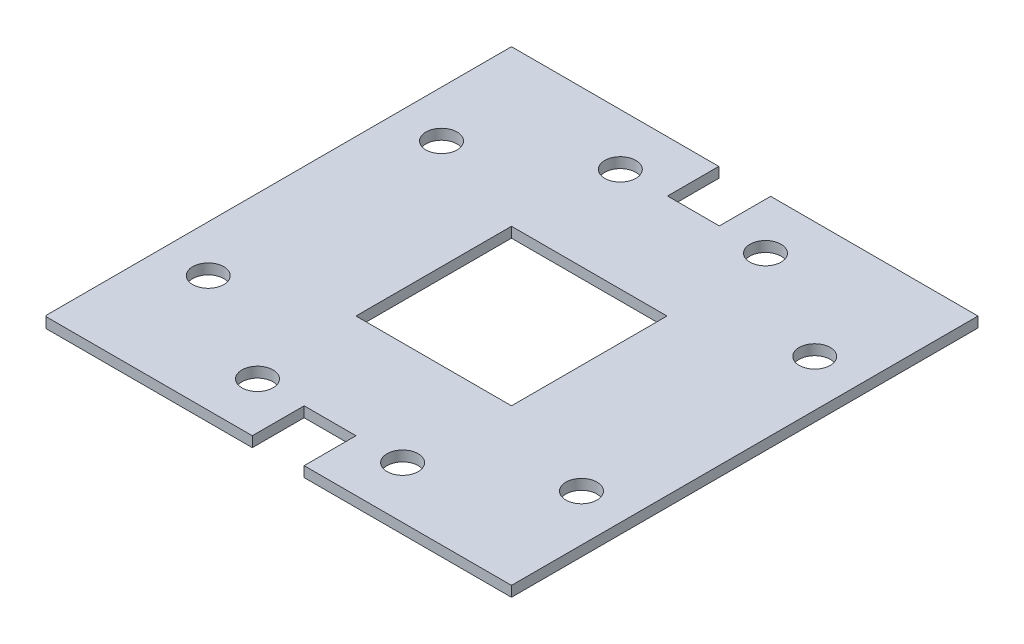
ISO-10303-21;
HEADER;
FILE_DESCRIPTION(('STEP AP214'),'2;1');
FILE_NAME('part.step','',(''),(''),'','','');
FILE_SCHEMA(('AUTOMOTIVE_DESIGN { 1 0 10303 214 1 1 1 1 }'));
ENDSEC;
DATA;
#1=APPLICATION_CONTEXT('core data for automotive mechanical design processes');
#2=APPLICATION_PROTOCOL_DEFINITION('international standard','automotive_design',2000,#1);
#3=PRODUCT_CONTEXT('',#1,'mechanical');
#4=PRODUCT('Part','Part','',(#3));
#5=PRODUCT_RELATED_PRODUCT_CATEGORY('part','',(#4));
#6=PRODUCT_DEFINITION_FORMATION('','',#4);
#7=PRODUCT_DEFINITION_CONTEXT('part definition',#1,'design');
#8=PRODUCT_DEFINITION('design','',#6,#7);
#9=PRODUCT_DEFINITION_SHAPE('','',#8);
#10=(LENGTH_UNIT() NAMED_UNIT(*) SI_UNIT(.MILLI.,.METRE.));
#11=(NAMED_UNIT(*) PLANE_ANGLE_UNIT() SI_UNIT($,.RADIAN.));
#12=(NAMED_UNIT(*) SI_UNIT($,.STERADIAN.) SOLID_ANGLE_UNIT());
#13=UNCERTAINTY_MEASURE_WITH_UNIT(LENGTH_MEASURE(1.E-05),#10,'distance_accuracy_value','');
#14=(GEOMETRIC_REPRESENTATION_CONTEXT(3) GLOBAL_UNCERTAINTY_ASSIGNED_CONTEXT((#13)) GLOBAL_UNIT_ASSIGNED_CONTEXT((#10,
#11,#12)) REPRESENTATION_CONTEXT('',''));
#15=CARTESIAN_POINT('',(0.,0.,0.));
#16=DIRECTION('',(0.,0.,1.));
#17=DIRECTION('',(1.,0.,0.));
#18=AXIS2_PLACEMENT_3D('',#15,#16,#17);
#19=CARTESIAN_POINT('',(0.,1.,15.));
#20=DIRECTION('',(0.,0.,-1.));
#21=DIRECTION('',(-1.,0.,0.));
#22=AXIS2_PLACEMENT_3D('',#19,#20,#21);
#23=PLANE('',#22);
#24=DIRECTION('',(1.,0.,0.));
#25=VECTOR('',#24,1.);
#26=CARTESIAN_POINT('',(0.,0.,15.));
#27=LINE('',#26,#25);
#28=CARTESIAN_POINT('',(-14.8984531823095,0.,15.));
#29=VERTEX_POINT('',#28);
#30=CARTESIAN_POINT('',(5.,0.,15.));
#31=VERTEX_POINT('',#30);
#32=EDGE_CURVE('E290',#29,#31,#27,.T.);
#33=ORIENTED_EDGE('',*,*,#32,.T.);
#34=DIRECTION('',(0.,1.,0.));
#35=VECTOR('',#34,1.);
#36=CARTESIAN_POINT('',(5.,-9.,15.));
#37=LINE('',#36,#35);
#38=CARTESIAN_POINT('',(5.,1.,15.));
#39=VERTEX_POINT('',#38);
#40=EDGE_CURVE('E191',#31,#39,#37,.T.);
#41=ORIENTED_EDGE('',*,*,#40,.T.);
#42=DIRECTION('',(1.,0.,0.));
#43=VECTOR('',#42,1.);
#44=CARTESIAN_POINT('',(0.,1.,15.));
#45=LINE('',#44,#43);
#46=CARTESIAN_POINT('',(-14.8984531823095,1.,15.));
#47=VERTEX_POINT('',#46);
#48=EDGE_CURVE('E238',#47,#39,#45,.T.);
#49=ORIENTED_EDGE('',*,*,#48,.F.);
#50=DIRECTION('',(0.,-1.,0.));
#51=VECTOR('',#50,1.);
#52=CARTESIAN_POINT('',(-14.8984531823095,1.,15.));
#53=LINE('',#52,#51);
#54=EDGE_CURVE('E311',#47,#29,#53,.T.);
#55=ORIENTED_EDGE('',*,*,#54,.T.);
#56=EDGE_LOOP('',(#33,#41,#49,#55));
#57=FACE_BOUND('',#56,.T.);
#58=ADVANCED_FACE('F34',(#57),#23,.F.);
#59=CARTESIAN_POINT('',(0.,1.,-30.));
#60=DIRECTION('',(0.,0.,-1.));
#61=DIRECTION('',(-1.,0.,0.));
#62=AXIS2_PLACEMENT_3D('',#59,#60,#61);
#63=PLANE('',#62);
#64=DIRECTION('',(0.,1.,0.));
#65=VECTOR('',#64,1.);
#66=CARTESIAN_POINT('',(5.,-9.,-30.));
#67=LINE('',#66,#65);
#68=CARTESIAN_POINT('',(5.,0.,-30.));
#69=VERTEX_POINT('',#68);
#70=CARTESIAN_POINT('',(5.,1.,-30.));
#71=VERTEX_POINT('',#70);
#72=EDGE_CURVE('E166',#69,#71,#67,.T.);
#73=ORIENTED_EDGE('',*,*,#72,.F.);
#74=DIRECTION('',(1.,0.,0.));
#75=VECTOR('',#74,1.);
#76=CARTESIAN_POINT('',(0.,0.,-30.));
#77=LINE('',#76,#75);
#78=CARTESIAN_POINT('',(-15.,0.,-30.));
#79=VERTEX_POINT('',#78);
#80=EDGE_CURVE('E297',#79,#69,#77,.T.);
#81=ORIENTED_EDGE('',*,*,#80,.F.);
#82=DIRECTION('',(0.,-1.,0.));
#83=VECTOR('',#82,1.);
#84=CARTESIAN_POINT('',(-15.,1.,-30.));
#85=LINE('',#84,#83);
#86=CARTESIAN_POINT('',(-15.,1.,-30.));
#87=VERTEX_POINT('',#86);
#88=EDGE_CURVE('E302',#87,#79,#85,.T.);
#89=ORIENTED_EDGE('',*,*,#88,.F.);
#90=DIRECTION('',(1.,0.,0.));
#91=VECTOR('',#90,1.);
#92=CARTESIAN_POINT('',(0.,1.,-30.));
#93=LINE('',#92,#91);
#94=EDGE_CURVE('E245',#87,#71,#93,.T.);
#95=ORIENTED_EDGE('',*,*,#94,.T.);
#96=EDGE_LOOP('',(#73,#81,#89,#95));
#97=FACE_BOUND('',#96,.T.);
#98=ADVANCED_FACE('F371',(#97),#63,.T.);
#99=CARTESIAN_POINT('',(-15.,1.,0.));
#100=DIRECTION('',(-1.,0.,0.));
#101=DIRECTION('',(0.,0.,1.));
#102=AXIS2_PLACEMENT_3D('',#99,#100,#101);
#103=PLANE('',#102);
#104=DIRECTION('',(0.,0.,-1.));
#105=VECTOR('',#104,1.);
#106=CARTESIAN_POINT('',(-15.,0.,0.));
#107=LINE('',#106,#105);
#108=CARTESIAN_POINT('',(-15.,0.,14.8984531823095));
#109=VERTEX_POINT('',#108);
#110=EDGE_CURVE('E283',#109,#79,#107,.T.);
#111=ORIENTED_EDGE('',*,*,#110,.F.);
#112=DIRECTION('',(0.,-1.,0.));
#113=VECTOR('',#112,1.);
#114=CARTESIAN_POINT('',(-15.,1.,14.8984531823095));
#115=LINE('',#114,#113);
#116=CARTESIAN_POINT('',(-15.,1.,14.8984531823095));
#117=VERTEX_POINT('',#116);
#118=EDGE_CURVE('E314',#117,#109,#115,.T.);
#119=ORIENTED_EDGE('',*,*,#118,.F.);
#120=DIRECTION('',(0.,0.,-1.));
#121=VECTOR('',#120,1.);
#122=CARTESIAN_POINT('',(-15.,1.,0.));
#123=LINE('',#122,#121);
#124=EDGE_CURVE('E231',#117,#87,#123,.T.);
#125=ORIENTED_EDGE('',*,*,#124,.T.);
#126=ORIENTED_EDGE('',*,*,#88,.T.);
#127=EDGE_LOOP('',(#111,#119,#125,#126));
#128=FACE_BOUND('',#127,.T.);
#129=ADVANCED_FACE('F368',(#128),#103,.T.);
#130=CARTESIAN_POINT('',(-12.4748737341527,1.,12.4748737341527));
#131=DIRECTION('',(0.,-1.,0.));
#132=DIRECTION('',(0.,0.,-1.));
#133=AXIS2_PLACEMENT_3D('',#130,#131,#132);
#134=CYLINDRICAL_SURFACE('',#133,3.5);
#135=CARTESIAN_POINT('',(-12.4748737341527,0.,12.4748737341527));
#136=DIRECTION('',(0.,1.,0.));
#137=DIRECTION('',(0.,0.,1.));
#138=AXIS2_PLACEMENT_3D('',#135,#136,#137);
#139=CIRCLE('',#138,3.5);
#140=EDGE_CURVE('E286',#109,#29,#139,.T.);
#141=ORIENTED_EDGE('',*,*,#140,.T.);
#142=ORIENTED_EDGE('',*,*,#54,.F.);
#143=CARTESIAN_POINT('',(-12.4748737341527,1.,12.4748737341527));
#144=DIRECTION('',(0.,1.,0.));
#145=DIRECTION('',(0.,0.,1.));
#146=AXIS2_PLACEMENT_3D('',#143,#144,#145);
#147=CIRCLE('',#146,3.5);
#148=EDGE_CURVE('E234',#117,#47,#147,.T.);
#149=ORIENTED_EDGE('',*,*,#148,.F.);
#150=ORIENTED_EDGE('',*,*,#118,.T.);
#151=EDGE_LOOP('',(#141,#142,#149,#150));
#152=FACE_BOUND('',#151,.T.);
#153=ADVANCED_FACE('F364',(#152),#134,.T.);
#154=CARTESIAN_POINT('',(9.99999999999999,1.,15.));
#155=VERTEX_POINT('',#154);
#156=CARTESIAN_POINT('',(30.,1.,15.));
#157=VERTEX_POINT('',#156);
#158=EDGE_CURVE('E237',#155,#157,#45,.T.);
#159=ORIENTED_EDGE('',*,*,#158,.F.);
#160=DIRECTION('',(0.,1.,0.));
#161=VECTOR('',#160,1.);
#162=CARTESIAN_POINT('',(9.99999999999999,-9.,15.));
#163=LINE('',#162,#161);
#164=CARTESIAN_POINT('',(9.99999999999999,0.,15.));
#165=VERTEX_POINT('',#164);
#166=EDGE_CURVE('E194',#165,#155,#163,.T.);
#167=ORIENTED_EDGE('',*,*,#166,.F.);
#168=CARTESIAN_POINT('',(30.,0.,15.));
#169=VERTEX_POINT('',#168);
#170=EDGE_CURVE('E289',#165,#169,#27,.T.);
#171=ORIENTED_EDGE('',*,*,#170,.T.);
#172=DIRECTION('',(0.,-1.,0.));
#173=VECTOR('',#172,1.);
#174=CARTESIAN_POINT('',(30.,1.,15.));
#175=LINE('',#174,#173);
#176=EDGE_CURVE('E308',#157,#169,#175,.T.);
#177=ORIENTED_EDGE('',*,*,#176,.F.);
#178=EDGE_LOOP('',(#159,#167,#171,#177));
#179=FACE_BOUND('',#178,.T.);
#180=ADVANCED_FACE('F350',(#179),#23,.F.);
#181=CARTESIAN_POINT('',(30.,1.,0.));
#182=DIRECTION('',(-1.,0.,0.));
#183=DIRECTION('',(0.,0.,1.));
#184=AXIS2_PLACEMENT_3D('',#181,#182,#183);
#185=PLANE('',#184);
#186=DIRECTION('',(0.,0.,-1.));
#187=VECTOR('',#186,1.);
#188=CARTESIAN_POINT('',(30.,0.,0.));
#189=LINE('',#188,#187);
#190=CARTESIAN_POINT('',(30.,0.,-30.));
#191=VERTEX_POINT('',#190);
#192=EDGE_CURVE('E293',#169,#191,#189,.T.);
#193=ORIENTED_EDGE('',*,*,#192,.T.);
#194=DIRECTION('',(0.,-1.,0.));
#195=VECTOR('',#194,1.);
#196=CARTESIAN_POINT('',(30.,1.,-30.));
#197=LINE('',#196,#195);
#198=CARTESIAN_POINT('',(30.,1.,-30.));
#199=VERTEX_POINT('',#198);
#200=EDGE_CURVE('E304',#199,#191,#197,.T.);
#201=ORIENTED_EDGE('',*,*,#200,.F.);
#202=DIRECTION('',(0.,0.,-1.));
#203=VECTOR('',#202,1.);
#204=CARTESIAN_POINT('',(30.,1.,0.));
#205=LINE('',#204,#203);
#206=EDGE_CURVE('E241',#157,#199,#205,.T.);
#207=ORIENTED_EDGE('',*,*,#206,.F.);
#208=ORIENTED_EDGE('',*,*,#176,.T.);
#209=EDGE_LOOP('',(#193,#201,#207,#208));
#210=FACE_BOUND('',#209,.T.);
#211=ADVANCED_FACE('F344',(#210),#185,.F.);
#212=CARTESIAN_POINT('',(15.,1.,0.));
#213=DIRECTION('',(-1.,0.,0.));
#214=DIRECTION('',(0.,0.,1.));
#215=AXIS2_PLACEMENT_3D('',#212,#213,#214);
#216=PLANE('',#215);
#217=DIRECTION('',(0.,0.,-1.));
#218=VECTOR('',#217,1.);
#219=CARTESIAN_POINT('',(15.,0.,0.));
#220=LINE('',#219,#218);
#221=CARTESIAN_POINT('',(15.,0.,0.));
#222=VERTEX_POINT('',#221);
#223=CARTESIAN_POINT('',(15.,0.,-15.));
#224=VERTEX_POINT('',#223);
#225=EDGE_CURVE('E268',#222,#224,#220,.T.);
#226=ORIENTED_EDGE('',*,*,#225,.F.);
#227=DIRECTION('',(0.,-1.,0.));
#228=VECTOR('',#227,1.);
#229=CARTESIAN_POINT('',(15.,1.,0.));
#230=LINE('',#229,#228);
#231=CARTESIAN_POINT('',(15.,1.,0.));
#232=VERTEX_POINT('',#231);
#233=EDGE_CURVE('E305',#232,#222,#230,.T.);
#234=ORIENTED_EDGE('',*,*,#233,.F.);
#235=DIRECTION('',(0.,0.,-1.));
#236=VECTOR('',#235,1.);
#237=CARTESIAN_POINT('',(15.,1.,0.));
#238=LINE('',#237,#236);
#239=CARTESIAN_POINT('',(15.,1.,-15.));
#240=VERTEX_POINT('',#239);
#241=EDGE_CURVE('E217',#232,#240,#238,.T.);
#242=ORIENTED_EDGE('',*,*,#241,.T.);
#243=DIRECTION('',(0.,-1.,0.));
#244=VECTOR('',#243,1.);
#245=CARTESIAN_POINT('',(15.,1.,-15.));
#246=LINE('',#245,#244);
#247=EDGE_CURVE('E250',#240,#224,#246,.T.);
#248=ORIENTED_EDGE('',*,*,#247,.T.);
#249=EDGE_LOOP('',(#226,#234,#242,#248));
#250=FACE_BOUND('',#249,.T.);
#251=ADVANCED_FACE('F398',(#250),#216,.T.);
#252=CARTESIAN_POINT('',(0.,1.,0.));
#253=DIRECTION('',(0.,0.,-1.));
#254=DIRECTION('',(-1.,0.,0.));
#255=AXIS2_PLACEMENT_3D('',#252,#253,#254);
#256=PLANE('',#255);
#257=DIRECTION('',(1.,0.,0.));
#258=VECTOR('',#257,1.);
#259=CARTESIAN_POINT('',(0.,0.,0.));
#260=LINE('',#259,#258);
#261=CARTESIAN_POINT('',(0.,0.,0.));
#262=VERTEX_POINT('',#261);
#263=EDGE_CURVE('E271',#262,#222,#260,.T.);
#264=ORIENTED_EDGE('',*,*,#263,.F.);
#265=DIRECTION('',(0.,-1.,0.));
#266=VECTOR('',#265,1.);
#267=CARTESIAN_POINT('',(0.,1.,0.));
#268=LINE('',#267,#266);
#269=CARTESIAN_POINT('',(0.,1.,0.));
#270=VERTEX_POINT('',#269);
#271=EDGE_CURVE('E321',#270,#262,#268,.T.);
#272=ORIENTED_EDGE('',*,*,#271,.F.);
#273=DIRECTION('',(1.,0.,0.));
#274=VECTOR('',#273,1.);
#275=CARTESIAN_POINT('',(0.,1.,0.));
#276=LINE('',#275,#274);
#277=EDGE_CURVE('E220',#270,#232,#276,.T.);
#278=ORIENTED_EDGE('',*,*,#277,.T.);
#279=ORIENTED_EDGE('',*,*,#233,.T.);
#280=EDGE_LOOP('',(#264,#272,#278,#279));
#281=FACE_BOUND('',#280,.T.);
#282=ADVANCED_FACE('F392',(#281),#256,.T.);
#283=CARTESIAN_POINT('',(0.,1.,0.));
#284=DIRECTION('',(-1.,0.,0.));
#285=DIRECTION('',(0.,0.,1.));
#286=AXIS2_PLACEMENT_3D('',#283,#284,#285);
#287=PLANE('',#286);
#288=DIRECTION('',(0.,0.,-1.));
#289=VECTOR('',#288,1.);
#290=CARTESIAN_POINT('',(0.,0.,0.));
#291=LINE('',#290,#289);
#292=CARTESIAN_POINT('',(0.,0.,-15.));
#293=VERTEX_POINT('',#292);
#294=EDGE_CURVE('E274',#262,#293,#291,.T.);
#295=ORIENTED_EDGE('',*,*,#294,.T.);
#296=DIRECTION('',(0.,-1.,0.));
#297=VECTOR('',#296,1.);
#298=CARTESIAN_POINT('',(0.,1.,-15.));
#299=LINE('',#298,#297);
#300=CARTESIAN_POINT('',(0.,1.,-15.));
#301=VERTEX_POINT('',#300);
#302=EDGE_CURVE('E318',#301,#293,#299,.T.);
#303=ORIENTED_EDGE('',*,*,#302,.F.);
#304=DIRECTION('',(0.,0.,-1.));
#305=VECTOR('',#304,1.);
#306=CARTESIAN_POINT('',(0.,1.,0.));
#307=LINE('',#306,#305);
#308=EDGE_CURVE('E223',#270,#301,#307,.T.);
#309=ORIENTED_EDGE('',*,*,#308,.F.);
#310=ORIENTED_EDGE('',*,*,#271,.T.);
#311=EDGE_LOOP('',(#295,#303,#309,#310));
#312=FACE_BOUND('',#311,.T.);
#313=ADVANCED_FACE('F384',(#312),#287,.F.);
#314=DIRECTION('',(0.,1.,0.));
#315=VECTOR('',#314,1.);
#316=CARTESIAN_POINT('',(9.99999999999999,-9.,-30.));
#317=LINE('',#316,#315);
#318=CARTESIAN_POINT('',(9.99999999999999,0.,-30.));
#319=VERTEX_POINT('',#318);
#320=CARTESIAN_POINT('',(9.99999999999999,1.,-30.));
#321=VERTEX_POINT('',#320);
#322=EDGE_CURVE('E180',#319,#321,#317,.T.);
#323=ORIENTED_EDGE('',*,*,#322,.T.);
#324=EDGE_CURVE('E244',#321,#199,#93,.T.);
#325=ORIENTED_EDGE('',*,*,#324,.T.);
#326=ORIENTED_EDGE('',*,*,#200,.T.);
#327=EDGE_CURVE('E296',#319,#191,#77,.T.);
#328=ORIENTED_EDGE('',*,*,#327,.F.);
#329=EDGE_LOOP('',(#323,#325,#326,#328));
#330=FACE_BOUND('',#329,.T.);
#331=ADVANCED_FACE('F340',(#330),#63,.T.);
#332=CARTESIAN_POINT('',(-10.5,1.,3.75));
#333=DIRECTION('',(0.,-1.,0.));
#334=DIRECTION('',(0.,0.,-1.));
#335=AXIS2_PLACEMENT_3D('',#332,#333,#334);
#336=CYLINDRICAL_SURFACE('',#335,1.5);
#337=CARTESIAN_POINT('',(-10.5,1.,3.75));
#338=DIRECTION('',(0.,1.,0.));
#339=DIRECTION('',(0.,0.,1.));
#340=AXIS2_PLACEMENT_3D('',#337,#338,#339);
#341=CIRCLE('',#340,1.5);
#342=CARTESIAN_POINT('',(-10.5,1.,5.25));
#343=VERTEX_POINT('',#342);
#344=EDGE_CURVE('E228',#343,#343,#341,.F.);
#345=ORIENTED_EDGE('',*,*,#344,.F.);
#346=EDGE_LOOP('',(#345));
#347=FACE_BOUND('',#346,.T.);
#348=CARTESIAN_POINT('',(-10.5,0.,3.75));
#349=DIRECTION('',(0.,1.,0.));
#350=DIRECTION('',(0.,0.,1.));
#351=AXIS2_PLACEMENT_3D('',#348,#349,#350);
#352=CIRCLE('',#351,1.5);
#353=CARTESIAN_POINT('',(-10.5,0.,5.25));
#354=VERTEX_POINT('',#353);
#355=EDGE_CURVE('E280',#354,#354,#352,.F.);
#356=ORIENTED_EDGE('',*,*,#355,.T.);
#357=EDGE_LOOP('',(#356));
#358=FACE_BOUND('',#357,.T.);
#359=ADVANCED_FACE('F383',(#347,#358),#336,.F.);
#360=CARTESIAN_POINT('',(0.,1.,-15.));
#361=DIRECTION('',(0.,0.,-1.));
#362=DIRECTION('',(-1.,0.,0.));
#363=AXIS2_PLACEMENT_3D('',#360,#361,#362);
#364=PLANE('',#363);
#365=DIRECTION('',(1.,0.,0.));
#366=VECTOR('',#365,1.);
#367=CARTESIAN_POINT('',(0.,0.,-15.));
#368=LINE('',#367,#366);
#369=EDGE_CURVE('E277',#293,#224,#368,.T.);
#370=ORIENTED_EDGE('',*,*,#369,.T.);
#371=ORIENTED_EDGE('',*,*,#247,.F.);
#372=DIRECTION('',(1.,0.,0.));
#373=VECTOR('',#372,1.);
#374=CARTESIAN_POINT('',(0.,1.,-15.));
#375=LINE('',#374,#373);
#376=EDGE_CURVE('E226',#301,#240,#375,.T.);
#377=ORIENTED_EDGE('',*,*,#376,.F.);
#378=ORIENTED_EDGE('',*,*,#302,.T.);
#379=EDGE_LOOP('',(#370,#371,#377,#378));
#380=FACE_BOUND('',#379,.T.);
#381=ADVANCED_FACE('F389',(#380),#364,.F.);
#382=CARTESIAN_POINT('',(-10.5,1.,-18.75));
#383=DIRECTION('',(0.,-1.,0.));
#384=DIRECTION('',(0.,0.,-1.));
#385=AXIS2_PLACEMENT_3D('',#382,#383,#384);
#386=CYLINDRICAL_SURFACE('',#385,1.5);
#387=CARTESIAN_POINT('',(-10.5,1.,-18.75));
#388=DIRECTION('',(0.,1.,0.));
#389=DIRECTION('',(0.,0.,1.));
#390=AXIS2_PLACEMENT_3D('',#387,#388,#389);
#391=CIRCLE('',#390,1.5);
#392=CARTESIAN_POINT('',(-10.5,1.,-17.25));
#393=VERTEX_POINT('',#392);
#394=EDGE_CURVE('E214',#393,#393,#391,.F.);
#395=ORIENTED_EDGE('',*,*,#394,.F.);
#396=EDGE_LOOP('',(#395));
#397=FACE_BOUND('',#396,.T.);
#398=CARTESIAN_POINT('',(-10.5,0.,-18.75));
#399=DIRECTION('',(0.,1.,0.));
#400=DIRECTION('',(0.,0.,1.));
#401=AXIS2_PLACEMENT_3D('',#398,#399,#400);
#402=CIRCLE('',#401,1.5);
#403=CARTESIAN_POINT('',(-10.5,0.,-17.25));
#404=VERTEX_POINT('',#403);
#405=EDGE_CURVE('E265',#404,#404,#402,.F.);
#406=ORIENTED_EDGE('',*,*,#405,.T.);
#407=EDGE_LOOP('',(#406));
#408=FACE_BOUND('',#407,.T.);
#409=ADVANCED_FACE('F406',(#397,#408),#386,.F.);
#410=CARTESIAN_POINT('',(0.499999999999996,1.,-25.));
#411=DIRECTION('',(0.,-1.,0.));
#412=DIRECTION('',(0.,0.,-1.));
#413=AXIS2_PLACEMENT_3D('',#410,#411,#412);
#414=CYLINDRICAL_SURFACE('',#413,1.5);
#415=CARTESIAN_POINT('',(0.499999999999996,1.,-25.));
#416=DIRECTION('',(0.,1.,0.));
#417=DIRECTION('',(0.,0.,1.));
#418=AXIS2_PLACEMENT_3D('',#415,#416,#417);
#419=CIRCLE('',#418,1.5);
#420=CARTESIAN_POINT('',(0.499999999999996,1.,-23.5));
#421=VERTEX_POINT('',#420);
#422=EDGE_CURVE('E211',#421,#421,#419,.T.);
#423=ORIENTED_EDGE('',*,*,#422,.T.);
#424=EDGE_LOOP('',(#423));
#425=FACE_BOUND('',#424,.T.);
#426=CARTESIAN_POINT('',(0.499999999999996,0.,-25.));
#427=DIRECTION('',(0.,1.,0.));
#428=DIRECTION('',(0.,0.,1.));
#429=AXIS2_PLACEMENT_3D('',#426,#427,#428);
#430=CIRCLE('',#429,1.5);
#431=CARTESIAN_POINT('',(0.499999999999996,0.,-23.5));
#432=VERTEX_POINT('',#431);
#433=EDGE_CURVE('E262',#432,#432,#430,.T.);
#434=ORIENTED_EDGE('',*,*,#433,.F.);
#435=EDGE_LOOP('',(#434));
#436=FACE_BOUND('',#435,.T.);
#437=ADVANCED_FACE('F409',(#425,#436),#414,.F.);
#438=CARTESIAN_POINT('',(14.5,1.,-25.));
#439=DIRECTION('',(0.,-1.,0.));
#440=DIRECTION('',(0.,0.,-1.));
#441=AXIS2_PLACEMENT_3D('',#438,#439,#440);
#442=CYLINDRICAL_SURFACE('',#441,1.5);
#443=CARTESIAN_POINT('',(14.5,1.,-25.));
#444=DIRECTION('',(0.,1.,0.));
#445=DIRECTION('',(0.,0.,1.));
#446=AXIS2_PLACEMENT_3D('',#443,#444,#445);
#447=CIRCLE('',#446,1.5);
#448=CARTESIAN_POINT('',(14.5,1.,-23.5));
#449=VERTEX_POINT('',#448);
#450=EDGE_CURVE('E208',#449,#449,#447,.T.);
#451=ORIENTED_EDGE('',*,*,#450,.T.);
#452=EDGE_LOOP('',(#451));
#453=FACE_BOUND('',#452,.T.);
#454=CARTESIAN_POINT('',(14.5,0.,-25.));
#455=DIRECTION('',(0.,1.,0.));
#456=DIRECTION('',(0.,0.,1.));
#457=AXIS2_PLACEMENT_3D('',#454,#455,#456);
#458=CIRCLE('',#457,1.5);
#459=CARTESIAN_POINT('',(14.5,0.,-23.5));
#460=VERTEX_POINT('',#459);
#461=EDGE_CURVE('E259',#460,#460,#458,.T.);
#462=ORIENTED_EDGE('',*,*,#461,.F.);
#463=EDGE_LOOP('',(#462));
#464=FACE_BOUND('',#463,.T.);
#465=ADVANCED_FACE('F413',(#453,#464),#442,.F.);
#466=CARTESIAN_POINT('',(14.5,1.,10.));
#467=DIRECTION('',(0.,-1.,0.));
#468=DIRECTION('',(0.,0.,-1.));
#469=AXIS2_PLACEMENT_3D('',#466,#467,#468);
#470=CYLINDRICAL_SURFACE('',#469,1.5);
#471=CARTESIAN_POINT('',(14.5,1.,10.));
#472=DIRECTION('',(0.,1.,0.));
#473=DIRECTION('',(0.,0.,1.));
#474=AXIS2_PLACEMENT_3D('',#471,#472,#473);
#475=CIRCLE('',#474,1.5);
#476=CARTESIAN_POINT('',(14.5,1.,11.5));
#477=VERTEX_POINT('',#476);
#478=EDGE_CURVE('E205',#477,#477,#475,.F.);
#479=ORIENTED_EDGE('',*,*,#478,.F.);
#480=EDGE_LOOP('',(#479));
#481=FACE_BOUND('',#480,.T.);
#482=CARTESIAN_POINT('',(14.5,0.,10.));
#483=DIRECTION('',(0.,1.,0.));
#484=DIRECTION('',(0.,0.,1.));
#485=AXIS2_PLACEMENT_3D('',#482,#483,#484);
#486=CIRCLE('',#485,1.5);
#487=CARTESIAN_POINT('',(14.5,0.,11.5));
#488=VERTEX_POINT('',#487);
#489=EDGE_CURVE('E256',#488,#488,#486,.F.);
#490=ORIENTED_EDGE('',*,*,#489,.T.);
#491=EDGE_LOOP('',(#490));
#492=FACE_BOUND('',#491,.T.);
#493=ADVANCED_FACE('F417',(#481,#492),#470,.F.);
#494=CARTESIAN_POINT('',(25.5,1.,-18.75));
#495=DIRECTION('',(0.,-1.,0.));
#496=DIRECTION('',(0.,0.,-1.));
#497=AXIS2_PLACEMENT_3D('',#494,#495,#496);
#498=CYLINDRICAL_SURFACE('',#497,1.5);
#499=CARTESIAN_POINT('',(25.5,1.,-18.75));
#500=DIRECTION('',(0.,1.,0.));
#501=DIRECTION('',(0.,0.,1.));
#502=AXIS2_PLACEMENT_3D('',#499,#500,#501);
#503=CIRCLE('',#502,1.5);
#504=CARTESIAN_POINT('',(25.5,1.,-17.25));
#505=VERTEX_POINT('',#504);
#506=EDGE_CURVE('E201',#505,#505,#503,.T.);
#507=ORIENTED_EDGE('',*,*,#506,.T.);
#508=EDGE_LOOP('',(#507));
#509=FACE_BOUND('',#508,.T.);
#510=CARTESIAN_POINT('',(25.5,0.,-18.75));
#511=DIRECTION('',(0.,1.,0.));
#512=DIRECTION('',(0.,0.,1.));
#513=AXIS2_PLACEMENT_3D('',#510,#511,#512);
#514=CIRCLE('',#513,1.5);
#515=CARTESIAN_POINT('',(25.5,0.,-17.25));
#516=VERTEX_POINT('',#515);
#517=EDGE_CURVE('E253',#516,#516,#514,.T.);
#518=ORIENTED_EDGE('',*,*,#517,.F.);
#519=EDGE_LOOP('',(#518));
#520=FACE_BOUND('',#519,.T.);
#521=ADVANCED_FACE('F420',(#509,#520),#498,.F.);
#522=CARTESIAN_POINT('',(25.5,1.,3.75));
#523=DIRECTION('',(0.,-1.,0.));
#524=DIRECTION('',(0.,0.,-1.));
#525=AXIS2_PLACEMENT_3D('',#522,#523,#524);
#526=CYLINDRICAL_SURFACE('',#525,1.5);
#527=CARTESIAN_POINT('',(25.5,1.,3.75));
#528=DIRECTION('',(0.,1.,0.));
#529=DIRECTION('',(0.,0.,1.));
#530=AXIS2_PLACEMENT_3D('',#527,#528,#529);
#531=CIRCLE('',#530,1.5);
#532=CARTESIAN_POINT('',(25.5,1.,5.25));
#533=VERTEX_POINT('',#532);
#534=EDGE_CURVE('E198',#533,#533,#531,.T.);
#535=ORIENTED_EDGE('',*,*,#534,.T.);
#536=EDGE_LOOP('',(#535));
#537=FACE_BOUND('',#536,.T.);
#538=CARTESIAN_POINT('',(25.5,0.,3.75));
#539=DIRECTION('',(0.,1.,0.));
#540=DIRECTION('',(0.,0.,1.));
#541=AXIS2_PLACEMENT_3D('',#538,#539,#540);
#542=CIRCLE('',#541,1.5);
#543=CARTESIAN_POINT('',(25.5,0.,5.25));
#544=VERTEX_POINT('',#543);
#545=EDGE_CURVE('E179',#544,#544,#542,.T.);
#546=ORIENTED_EDGE('',*,*,#545,.F.);
#547=EDGE_LOOP('',(#546));
#548=FACE_BOUND('',#547,.T.);
#549=ADVANCED_FACE('F36',(#537,#548),#526,.F.);
#550=CARTESIAN_POINT('',(0.499999999999996,1.,10.));
#551=DIRECTION('',(0.,-1.,0.));
#552=DIRECTION('',(0.,0.,-1.));
#553=AXIS2_PLACEMENT_3D('',#550,#551,#552);
#554=CYLINDRICAL_SURFACE('',#553,1.5);
#555=CARTESIAN_POINT('',(0.499999999999996,1.,10.));
#556=DIRECTION('',(0.,1.,0.));
#557=DIRECTION('',(0.,0.,1.));
#558=AXIS2_PLACEMENT_3D('',#555,#556,#557);
#559=CIRCLE('',#558,1.5);
#560=CARTESIAN_POINT('',(0.499999999999996,1.,11.5));
#561=VERTEX_POINT('',#560);
#562=EDGE_CURVE('E247',#561,#561,#559,.F.);
#563=ORIENTED_EDGE('',*,*,#562,.F.);
#564=EDGE_LOOP('',(#563));
#565=FACE_BOUND('',#564,.T.);
#566=CARTESIAN_POINT('',(0.499999999999996,0.,10.));
#567=DIRECTION('',(0.,1.,0.));
#568=DIRECTION('',(0.,0.,1.));
#569=AXIS2_PLACEMENT_3D('',#566,#567,#568);
#570=CIRCLE('',#569,1.5);
#571=CARTESIAN_POINT('',(0.499999999999996,0.,11.5));
#572=VERTEX_POINT('',#571);
#573=EDGE_CURVE('E202',#572,#572,#570,.F.);
#574=ORIENTED_EDGE('',*,*,#573,.T.);
#575=EDGE_LOOP('',(#574));
#576=FACE_BOUND('',#575,.T.);
#577=ADVANCED_FACE('F427',(#565,#576),#554,.F.);
#578=CARTESIAN_POINT('',(0.,1.,0.));
#579=DIRECTION('',(0.,1.,0.));
#580=DIRECTION('',(0.,0.,1.));
#581=AXIS2_PLACEMENT_3D('',#578,#579,#580);
#582=PLANE('',#581);
#583=DIRECTION('',(0.,0.,1.));
#584=VECTOR('',#583,1.);
#585=CARTESIAN_POINT('',(5.,1.,-30.));
#586=LINE('',#585,#584);
#587=CARTESIAN_POINT('',(5.,1.,-25.0507734088452));
#588=VERTEX_POINT('',#587);
#589=EDGE_CURVE('E163',#71,#588,#586,.T.);
#590=ORIENTED_EDGE('',*,*,#589,.F.);
#591=ORIENTED_EDGE('',*,*,#94,.F.);
#592=ORIENTED_EDGE('',*,*,#124,.F.);
#593=ORIENTED_EDGE('',*,*,#148,.T.);
#594=ORIENTED_EDGE('',*,*,#48,.T.);
#595=DIRECTION('',(0.,0.,1.));
#596=VECTOR('',#595,1.);
#597=CARTESIAN_POINT('',(5.,1.,15.));
#598=LINE('',#597,#596);
#599=CARTESIAN_POINT('',(5.,1.,10.));
#600=VERTEX_POINT('',#599);
#601=EDGE_CURVE('E184',#600,#39,#598,.T.);
#602=ORIENTED_EDGE('',*,*,#601,.F.);
#603=DIRECTION('',(-1.,0.,0.));
#604=VECTOR('',#603,1.);
#605=CARTESIAN_POINT('',(5.,1.,10.));
#606=LINE('',#605,#604);
#607=CARTESIAN_POINT('',(10.,1.,10.));
#608=VERTEX_POINT('',#607);
#609=EDGE_CURVE('E188',#608,#600,#606,.T.);
#610=ORIENTED_EDGE('',*,*,#609,.F.);
#611=DIRECTION('',(0.,0.,-1.));
#612=VECTOR('',#611,1.);
#613=CARTESIAN_POINT('',(9.99999999999999,1.,15.));
#614=LINE('',#613,#612);
#615=EDGE_CURVE('E186',#155,#608,#614,.T.);
#616=ORIENTED_EDGE('',*,*,#615,.F.);
#617=ORIENTED_EDGE('',*,*,#158,.T.);
#618=ORIENTED_EDGE('',*,*,#206,.T.);
#619=ORIENTED_EDGE('',*,*,#324,.F.);
#620=DIRECTION('',(0.,0.,-1.));
#621=VECTOR('',#620,1.);
#622=CARTESIAN_POINT('',(9.99999999999999,1.,-30.));
#623=LINE('',#622,#621);
#624=CARTESIAN_POINT('',(9.99999999999999,1.,-25.0507734088452));
#625=VERTEX_POINT('',#624);
#626=EDGE_CURVE('E160',#625,#321,#623,.T.);
#627=ORIENTED_EDGE('',*,*,#626,.F.);
#628=DIRECTION('',(1.,0.,0.));
#629=VECTOR('',#628,1.);
#630=CARTESIAN_POINT('',(5.,1.,-25.0507734088452));
#631=LINE('',#630,#629);
#632=EDGE_CURVE('E155',#588,#625,#631,.T.);
#633=ORIENTED_EDGE('',*,*,#632,.F.);
#634=EDGE_LOOP('',(#590,#591,#592,#593,#594,#602,#610,#616,#617,#618,#619,#627,#633));
#635=FACE_BOUND('',#634,.T.);
#636=ORIENTED_EDGE('',*,*,#534,.F.);
#637=EDGE_LOOP('',(#636));
#638=FACE_BOUND('',#637,.T.);
#639=ORIENTED_EDGE('',*,*,#506,.F.);
#640=EDGE_LOOP('',(#639));
#641=FACE_BOUND('',#640,.T.);
#642=ORIENTED_EDGE('',*,*,#478,.T.);
#643=EDGE_LOOP('',(#642));
#644=FACE_BOUND('',#643,.T.);
#645=ORIENTED_EDGE('',*,*,#450,.F.);
#646=EDGE_LOOP('',(#645));
#647=FACE_BOUND('',#646,.T.);
#648=ORIENTED_EDGE('',*,*,#422,.F.);
#649=EDGE_LOOP('',(#648));
#650=FACE_BOUND('',#649,.T.);
#651=ORIENTED_EDGE('',*,*,#394,.T.);
#652=EDGE_LOOP('',(#651));
#653=FACE_BOUND('',#652,.T.);
#654=ORIENTED_EDGE('',*,*,#241,.F.);
#655=ORIENTED_EDGE('',*,*,#277,.F.);
#656=ORIENTED_EDGE('',*,*,#308,.T.);
#657=ORIENTED_EDGE('',*,*,#376,.T.);
#658=EDGE_LOOP('',(#654,#655,#656,#657));
#659=FACE_BOUND('',#658,.T.);
#660=ORIENTED_EDGE('',*,*,#344,.T.);
#661=EDGE_LOOP('',(#660));
#662=FACE_BOUND('',#661,.T.);
#663=ORIENTED_EDGE('',*,*,#562,.T.);
#664=EDGE_LOOP('',(#663));
#665=FACE_BOUND('',#664,.T.);
#666=ADVANCED_FACE('F172',(#635,#638,#641,#644,#647,#650,#653,#659,#662,#665),#582,.T.);
#667=CARTESIAN_POINT('',(0.,0.,0.));
#668=DIRECTION('',(0.,1.,0.));
#669=DIRECTION('',(0.,0.,1.));
#670=AXIS2_PLACEMENT_3D('',#667,#668,#669);
#671=PLANE('',#670);
#672=ORIENTED_EDGE('',*,*,#80,.T.);
#673=DIRECTION('',(0.,0.,1.));
#674=VECTOR('',#673,1.);
#675=CARTESIAN_POINT('',(5.,0.,0.));
#676=LINE('',#675,#674);
#677=CARTESIAN_POINT('',(5.,0.,-25.0507734088452));
#678=VERTEX_POINT('',#677);
#679=EDGE_CURVE('E11',#69,#678,#676,.T.);
#680=ORIENTED_EDGE('',*,*,#679,.T.);
#681=DIRECTION('',(1.,0.,0.));
#682=VECTOR('',#681,1.);
#683=CARTESIAN_POINT('',(0.,0.,-25.0507734088452));
#684=LINE('',#683,#682);
#685=CARTESIAN_POINT('',(9.99999999999999,0.,-25.0507734088452));
#686=VERTEX_POINT('',#685);
#687=EDGE_CURVE('E158',#678,#686,#684,.T.);
#688=ORIENTED_EDGE('',*,*,#687,.T.);
#689=DIRECTION('',(0.,0.,-1.));
#690=VECTOR('',#689,1.);
#691=CARTESIAN_POINT('',(10.,0.,0.));
#692=LINE('',#691,#690);
#693=EDGE_CURVE('E42',#686,#319,#692,.T.);
#694=ORIENTED_EDGE('',*,*,#693,.T.);
#695=ORIENTED_EDGE('',*,*,#327,.T.);
#696=ORIENTED_EDGE('',*,*,#192,.F.);
#697=ORIENTED_EDGE('',*,*,#170,.F.);
#698=DIRECTION('',(0.,0.,-1.));
#699=VECTOR('',#698,1.);
#700=CARTESIAN_POINT('',(10.,0.,0.));
#701=LINE('',#700,#699);
#702=CARTESIAN_POINT('',(10.,0.,10.));
#703=VERTEX_POINT('',#702);
#704=EDGE_CURVE('E316',#165,#703,#701,.T.);
#705=ORIENTED_EDGE('',*,*,#704,.T.);
#706=DIRECTION('',(-1.,0.,0.));
#707=VECTOR('',#706,1.);
#708=CARTESIAN_POINT('',(0.,0.,9.99999999999999));
#709=LINE('',#708,#707);
#710=CARTESIAN_POINT('',(5.,0.,10.));
#711=VERTEX_POINT('',#710);
#712=EDGE_CURVE('E326',#703,#711,#709,.T.);
#713=ORIENTED_EDGE('',*,*,#712,.T.);
#714=DIRECTION('',(0.,0.,1.));
#715=VECTOR('',#714,1.);
#716=CARTESIAN_POINT('',(4.99999999999999,0.,0.));
#717=LINE('',#716,#715);
#718=EDGE_CURVE('E329',#711,#31,#717,.T.);
#719=ORIENTED_EDGE('',*,*,#718,.T.);
#720=ORIENTED_EDGE('',*,*,#32,.F.);
#721=ORIENTED_EDGE('',*,*,#140,.F.);
#722=ORIENTED_EDGE('',*,*,#110,.T.);
#723=EDGE_LOOP('',(#672,#680,#688,#694,#695,#696,#697,#705,#713,#719,#720,#721,#722));
#724=FACE_BOUND('',#723,.T.);
#725=ORIENTED_EDGE('',*,*,#545,.T.);
#726=EDGE_LOOP('',(#725));
#727=FACE_BOUND('',#726,.T.);
#728=ORIENTED_EDGE('',*,*,#517,.T.);
#729=EDGE_LOOP('',(#728));
#730=FACE_BOUND('',#729,.T.);
#731=ORIENTED_EDGE('',*,*,#489,.F.);
#732=EDGE_LOOP('',(#731));
#733=FACE_BOUND('',#732,.T.);
#734=ORIENTED_EDGE('',*,*,#461,.T.);
#735=EDGE_LOOP('',(#734));
#736=FACE_BOUND('',#735,.T.);
#737=ORIENTED_EDGE('',*,*,#433,.T.);
#738=EDGE_LOOP('',(#737));
#739=FACE_BOUND('',#738,.T.);
#740=ORIENTED_EDGE('',*,*,#405,.F.);
#741=EDGE_LOOP('',(#740));
#742=FACE_BOUND('',#741,.T.);
#743=ORIENTED_EDGE('',*,*,#225,.T.);
#744=ORIENTED_EDGE('',*,*,#369,.F.);
#745=ORIENTED_EDGE('',*,*,#294,.F.);
#746=ORIENTED_EDGE('',*,*,#263,.T.);
#747=EDGE_LOOP('',(#743,#744,#745,#746));
#748=FACE_BOUND('',#747,.T.);
#749=ORIENTED_EDGE('',*,*,#355,.F.);
#750=EDGE_LOOP('',(#749));
#751=FACE_BOUND('',#750,.T.);
#752=ORIENTED_EDGE('',*,*,#573,.F.);
#753=EDGE_LOOP('',(#752));
#754=FACE_BOUND('',#753,.T.);
#755=ADVANCED_FACE('F335',(#724,#727,#730,#733,#736,#739,#742,#748,#751,#754),#671,.F.);
#756=CARTESIAN_POINT('',(5.,-9.,15.));
#757=DIRECTION('',(-1.,0.,0.));
#758=DIRECTION('',(0.,0.,1.));
#759=AXIS2_PLACEMENT_3D('',#756,#757,#758);
#760=PLANE('',#759);
#761=DIRECTION('',(0.,1.,0.));
#762=VECTOR('',#761,1.);
#763=CARTESIAN_POINT('',(5.,-9.,10.));
#764=LINE('',#763,#762);
#765=EDGE_CURVE('E170',#711,#600,#764,.T.);
#766=ORIENTED_EDGE('',*,*,#765,.T.);
#767=ORIENTED_EDGE('',*,*,#601,.T.);
#768=ORIENTED_EDGE('',*,*,#40,.F.);
#769=ORIENTED_EDGE('',*,*,#718,.F.);
#770=EDGE_LOOP('',(#766,#767,#768,#769));
#771=FACE_BOUND('',#770,.T.);
#772=ADVANCED_FACE('F435',(#771),#760,.F.);
#773=CARTESIAN_POINT('',(5.,-9.,10.));
#774=DIRECTION('',(0.,0.,-1.));
#775=DIRECTION('',(-1.,0.,0.));
#776=AXIS2_PLACEMENT_3D('',#773,#774,#775);
#777=PLANE('',#776);
#778=DIRECTION('',(0.,1.,0.));
#779=VECTOR('',#778,1.);
#780=CARTESIAN_POINT('',(10.,-9.,10.));
#781=LINE('',#780,#779);
#782=EDGE_CURVE('E57',#703,#608,#781,.T.);
#783=ORIENTED_EDGE('',*,*,#782,.T.);
#784=ORIENTED_EDGE('',*,*,#609,.T.);
#785=ORIENTED_EDGE('',*,*,#765,.F.);
#786=ORIENTED_EDGE('',*,*,#712,.F.);
#787=EDGE_LOOP('',(#783,#784,#785,#786));
#788=FACE_BOUND('',#787,.T.);
#789=ADVANCED_FACE('F357',(#788),#777,.F.);
#790=CARTESIAN_POINT('',(9.99999999999999,-9.,15.));
#791=DIRECTION('',(1.,0.,0.));
#792=DIRECTION('',(0.,0.,-1.));
#793=AXIS2_PLACEMENT_3D('',#790,#791,#792);
#794=PLANE('',#793);
#795=ORIENTED_EDGE('',*,*,#166,.T.);
#796=ORIENTED_EDGE('',*,*,#615,.T.);
#797=ORIENTED_EDGE('',*,*,#782,.F.);
#798=ORIENTED_EDGE('',*,*,#704,.F.);
#799=EDGE_LOOP('',(#795,#796,#797,#798));
#800=FACE_BOUND('',#799,.T.);
#801=ADVANCED_FACE('F352',(#800),#794,.F.);
#802=CARTESIAN_POINT('',(5.,-9.,-30.));
#803=DIRECTION('',(-1.,0.,0.));
#804=DIRECTION('',(0.,0.,1.));
#805=AXIS2_PLACEMENT_3D('',#802,#803,#804);
#806=PLANE('',#805);
#807=ORIENTED_EDGE('',*,*,#72,.T.);
#808=ORIENTED_EDGE('',*,*,#589,.T.);
#809=DIRECTION('',(0.,1.,0.));
#810=VECTOR('',#809,1.);
#811=CARTESIAN_POINT('',(5.,-9.,-25.0507734088452));
#812=LINE('',#811,#810);
#813=EDGE_CURVE('E151',#678,#588,#812,.T.);
#814=ORIENTED_EDGE('',*,*,#813,.F.);
#815=ORIENTED_EDGE('',*,*,#679,.F.);
#816=EDGE_LOOP('',(#807,#808,#814,#815));
#817=FACE_BOUND('',#816,.T.);
#818=ADVANCED_FACE('F164',(#817),#806,.F.);
#819=CARTESIAN_POINT('',(9.99999999999999,-9.,-30.));
#820=DIRECTION('',(1.,0.,0.));
#821=DIRECTION('',(0.,0.,-1.));
#822=AXIS2_PLACEMENT_3D('',#819,#820,#821);
#823=PLANE('',#822);
#824=DIRECTION('',(0.,1.,0.));
#825=VECTOR('',#824,1.);
#826=CARTESIAN_POINT('',(9.99999999999999,-9.,-25.0507734088452));
#827=LINE('',#826,#825);
#828=EDGE_CURVE('E49',#686,#625,#827,.T.);
#829=ORIENTED_EDGE('',*,*,#828,.T.);
#830=ORIENTED_EDGE('',*,*,#626,.T.);
#831=ORIENTED_EDGE('',*,*,#322,.F.);
#832=ORIENTED_EDGE('',*,*,#693,.F.);
#833=EDGE_LOOP('',(#829,#830,#831,#832));
#834=FACE_BOUND('',#833,.T.);
#835=ADVANCED_FACE('F467',(#834),#823,.F.);
#836=CARTESIAN_POINT('',(5.,-9.,-25.0507734088452));
#837=DIRECTION('',(0.,0.,1.));
#838=DIRECTION('',(1.,0.,0.));
#839=AXIS2_PLACEMENT_3D('',#836,#837,#838);
#840=PLANE('',#839);
#841=ORIENTED_EDGE('',*,*,#813,.T.);
#842=ORIENTED_EDGE('',*,*,#632,.T.);
#843=ORIENTED_EDGE('',*,*,#828,.F.);
#844=ORIENTED_EDGE('',*,*,#687,.F.);
#845=EDGE_LOOP('',(#841,#842,#843,#844));
#846=FACE_BOUND('',#845,.T.);
#847=ADVANCED_FACE('F153',(#846),#840,.F.);
#848=CLOSED_SHELL('',(#58,#98,#129,#153,#180,#211,#251,#282,#313,#331,#359,#381,#409,#437,#465,
#493,#521,#549,#577,#666,#755,#772,#789,#801,#818,#835,#847));
#849=MANIFOLD_SOLID_BREP('B2',#848);
#850=ADVANCED_BREP_SHAPE_REPRESENTATION('',(#18,#849),#14);
#851=SHAPE_DEFINITION_REPRESENTATION(#9,#850);
ENDSEC;
END-ISO-10303-21;
